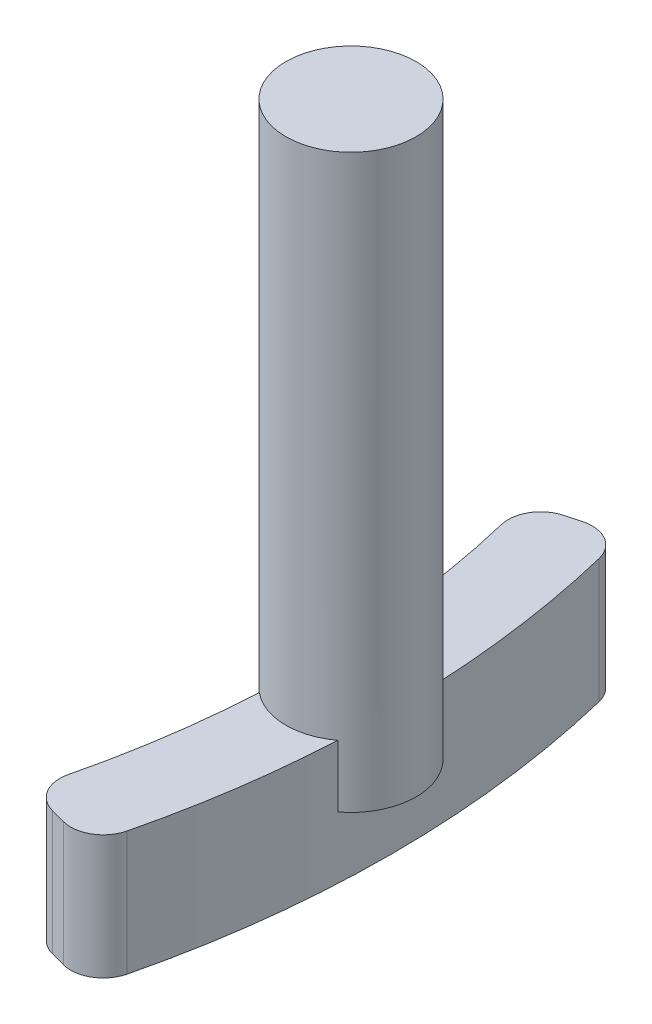
ISO-10303-21;
HEADER;
FILE_DESCRIPTION(('STEP AP214'),'2;1');
FILE_NAME('part.step','',(''),(''),'','','');
FILE_SCHEMA(('AUTOMOTIVE_DESIGN { 1 0 10303 214 1 1 1 1 }'));
ENDSEC;
DATA;
#1=APPLICATION_CONTEXT('core data for automotive mechanical design processes');
#2=APPLICATION_PROTOCOL_DEFINITION('international standard','automotive_design',2000,#1);
#3=PRODUCT_CONTEXT('',#1,'mechanical');
#4=PRODUCT('Part','Part','',(#3));
#5=PRODUCT_RELATED_PRODUCT_CATEGORY('part','',(#4));
#6=PRODUCT_DEFINITION_FORMATION('','',#4);
#7=PRODUCT_DEFINITION_CONTEXT('part definition',#1,'design');
#8=PRODUCT_DEFINITION('design','',#6,#7);
#9=PRODUCT_DEFINITION_SHAPE('','',#8);
#10=(LENGTH_UNIT() NAMED_UNIT(*) SI_UNIT(.MILLI.,.METRE.));
#11=(NAMED_UNIT(*) PLANE_ANGLE_UNIT() SI_UNIT($,.RADIAN.));
#12=(NAMED_UNIT(*) SI_UNIT($,.STERADIAN.) SOLID_ANGLE_UNIT());
#13=UNCERTAINTY_MEASURE_WITH_UNIT(LENGTH_MEASURE(1.E-05),#10,'distance_accuracy_value','');
#14=(GEOMETRIC_REPRESENTATION_CONTEXT(3) GLOBAL_UNCERTAINTY_ASSIGNED_CONTEXT((#13)) GLOBAL_UNIT_ASSIGNED_CONTEXT((#10,
#11,#12)) REPRESENTATION_CONTEXT('',''));
#15=CARTESIAN_POINT('',(0.,0.,0.));
#16=DIRECTION('',(0.,0.,1.));
#17=DIRECTION('',(1.,0.,0.));
#18=AXIS2_PLACEMENT_3D('',#15,#16,#17);
#19=CARTESIAN_POINT('',(-30.5687487202427,4.,-6.82173660494919E-13));
#20=DIRECTION('',(0.,-1.,0.));
#21=DIRECTION('',(0.,0.,-1.));
#22=AXIS2_PLACEMENT_3D('',#19,#20,#21);
#23=CYLINDRICAL_SURFACE('',#22,32.2999999999997);
#24=DIRECTION('',(0.,-1.,0.));
#25=VECTOR('',#24,1.);
#26=CARTESIAN_POINT('',(1.687380312015,11.22,1.68289626962537));
#27=LINE('',#26,#25);
#28=CARTESIAN_POINT('',(1.68738031201498,4.,1.68289626962534));
#29=VERTEX_POINT('',#28);
#30=CARTESIAN_POINT('',(1.68738031201497,2.,1.68289626962539));
#31=VERTEX_POINT('',#30);
#32=EDGE_CURVE('E201',#29,#31,#27,.T.);
#33=ORIENTED_EDGE('',*,*,#32,.F.);
#34=CARTESIAN_POINT('',(-30.5687487202427,4.,-6.82173660494919E-13));
#35=DIRECTION('',(0.,1.,0.));
#36=DIRECTION('',(0.,0.,1.));
#37=AXIS2_PLACEMENT_3D('',#34,#35,#36);
#38=CIRCLE('',#37,32.2999999999997);
#39=CARTESIAN_POINT('',(0.822305269976738,4.,7.6086614711849));
#40=VERTEX_POINT('',#39);
#41=EDGE_CURVE('E190',#40,#29,#38,.T.);
#42=ORIENTED_EDGE('',*,*,#41,.F.);
#43=DIRECTION('',(0.,-1.,0.));
#44=VECTOR('',#43,1.);
#45=CARTESIAN_POINT('',(0.822305269976738,4.,7.6086614711849));
#46=LINE('',#45,#44);
#47=CARTESIAN_POINT('',(0.822305269976738,0.,7.6086614711849));
#48=VERTEX_POINT('',#47);
#49=EDGE_CURVE('E151',#40,#48,#46,.T.);
#50=ORIENTED_EDGE('',*,*,#49,.T.);
#51=CARTESIAN_POINT('',(-30.5687487202427,0.,-6.82173660494919E-13));
#52=DIRECTION('',(0.,1.,0.));
#53=DIRECTION('',(0.,0.,1.));
#54=AXIS2_PLACEMENT_3D('',#51,#52,#53);
#55=CIRCLE('',#54,32.2999999999997);
#56=CARTESIAN_POINT('',(0.82230526997655,0.,-7.60866147118717));
#57=VERTEX_POINT('',#56);
#58=EDGE_CURVE('E176',#48,#57,#55,.T.);
#59=ORIENTED_EDGE('',*,*,#58,.T.);
#60=DIRECTION('',(0.,-1.,0.));
#61=VECTOR('',#60,1.);
#62=CARTESIAN_POINT('',(0.82230526997655,4.,-7.60866147118717));
#63=LINE('',#62,#61);
#64=CARTESIAN_POINT('',(0.82230526997655,4.,-7.60866147118717));
#65=VERTEX_POINT('',#64);
#66=EDGE_CURVE('E154',#65,#57,#63,.T.);
#67=ORIENTED_EDGE('',*,*,#66,.F.);
#68=CARTESIAN_POINT('',(1.68738031201505,4.,-1.68289626962529));
#69=VERTEX_POINT('',#68);
#70=EDGE_CURVE('E193',#69,#65,#38,.T.);
#71=ORIENTED_EDGE('',*,*,#70,.F.);
#72=DIRECTION('',(0.,-1.,0.));
#73=VECTOR('',#72,1.);
#74=CARTESIAN_POINT('',(1.68738031201508,11.22,-1.68289626962532));
#75=LINE('',#74,#73);
#76=CARTESIAN_POINT('',(1.68738031201505,2.,-1.68289626962534));
#77=VERTEX_POINT('',#76);
#78=EDGE_CURVE('E48',#77,#69,#75,.F.);
#79=ORIENTED_EDGE('',*,*,#78,.F.);
#80=CARTESIAN_POINT('',(-30.5687487202427,2.,-6.82173660494919E-13));
#81=DIRECTION('',(0.,1.,0.));
#82=DIRECTION('',(0.,0.,1.));
#83=AXIS2_PLACEMENT_3D('',#80,#81,#82);
#84=CIRCLE('',#83,32.2999999999997);
#85=EDGE_CURVE('E52',#31,#77,#84,.T.);
#86=ORIENTED_EDGE('',*,*,#85,.F.);
#87=EDGE_LOOP('',(#33,#42,#50,#59,#67,#71,#79,#86));
#88=FACE_BOUND('',#87,.T.);
#89=ADVANCED_FACE('F33',(#88),#23,.T.);
#90=CARTESIAN_POINT('',(-30.5687487202427,4.,-6.82173660494919E-13));
#91=DIRECTION('',(0.,-1.,0.));
#92=DIRECTION('',(0.,0.,-1.));
#93=AXIS2_PLACEMENT_3D('',#90,#91,#92);
#94=CYLINDRICAL_SURFACE('',#93,29.6999999999998);
#95=DIRECTION('',(0.,-1.,0.));
#96=VECTOR('',#95,1.);
#97=CARTESIAN_POINT('',(-0.912619687984859,11.22,1.61369477351205));
#98=LINE('',#97,#96);
#99=CARTESIAN_POINT('',(-0.912619687984854,2.,1.61369477351206));
#100=VERTEX_POINT('',#99);
#101=CARTESIAN_POINT('',(-0.91261968798485,4.,1.61369477351204));
#102=VERTEX_POINT('',#101);
#103=EDGE_CURVE('E203',#100,#102,#98,.F.);
#104=ORIENTED_EDGE('',*,*,#103,.F.);
#105=CARTESIAN_POINT('',(-30.5687487202427,2.,-6.82173660494919E-13));
#106=DIRECTION('',(0.,1.,0.));
#107=DIRECTION('',(0.,0.,1.));
#108=AXIS2_PLACEMENT_3D('',#105,#106,#107);
#109=CIRCLE('',#108,29.6999999999998);
#110=CARTESIAN_POINT('',(-0.912619687984783,2.,-1.61369477351212));
#111=VERTEX_POINT('',#110);
#112=EDGE_CURVE('E11',#111,#100,#109,.F.);
#113=ORIENTED_EDGE('',*,*,#112,.F.);
#114=DIRECTION('',(0.,-1.,0.));
#115=VECTOR('',#114,1.);
#116=CARTESIAN_POINT('',(-0.91261968798479,11.22,-1.61369477351211));
#117=LINE('',#116,#115);
#118=CARTESIAN_POINT('',(-0.91261968798478,4.,-1.6136947735121));
#119=VERTEX_POINT('',#118);
#120=EDGE_CURVE('E134',#119,#111,#117,.T.);
#121=ORIENTED_EDGE('',*,*,#120,.F.);
#122=CARTESIAN_POINT('',(-30.5687487202427,4.,-6.82173660494919E-13));
#123=DIRECTION('',(0.,-1.,0.));
#124=DIRECTION('',(0.,0.,1.));
#125=AXIS2_PLACEMENT_3D('',#122,#123,#124);
#126=CIRCLE('',#125,29.6999999999998);
#127=CARTESIAN_POINT('',(-1.70179997284685,4.,-6.98493163998171));
#128=VERTEX_POINT('',#127);
#129=EDGE_CURVE('E120',#128,#119,#126,.T.);
#130=ORIENTED_EDGE('',*,*,#129,.F.);
#131=DIRECTION('',(0.,-1.,0.));
#132=VECTOR('',#131,1.);
#133=CARTESIAN_POINT('',(-1.70179997284685,4.,-6.98493163998171));
#134=LINE('',#133,#132);
#135=CARTESIAN_POINT('',(-1.70179997284685,0.,-6.98493163998171));
#136=VERTEX_POINT('',#135);
#137=EDGE_CURVE('E163',#128,#136,#134,.T.);
#138=ORIENTED_EDGE('',*,*,#137,.T.);
#139=CARTESIAN_POINT('',(-30.5687487202427,0.,-6.82173660494919E-13));
#140=DIRECTION('',(0.,-1.,0.));
#141=DIRECTION('',(0.,0.,1.));
#142=AXIS2_PLACEMENT_3D('',#139,#140,#141);
#143=CIRCLE('',#142,29.6999999999998);
#144=CARTESIAN_POINT('',(-1.7017999728469,0.,6.98493163998071));
#145=VERTEX_POINT('',#144);
#146=EDGE_CURVE('E167',#136,#145,#143,.T.);
#147=ORIENTED_EDGE('',*,*,#146,.T.);
#148=DIRECTION('',(0.,-1.,0.));
#149=VECTOR('',#148,1.);
#150=CARTESIAN_POINT('',(-1.7017999728469,4.,6.98493163998071));
#151=LINE('',#150,#149);
#152=CARTESIAN_POINT('',(-1.7017999728469,4.,6.98493163998071));
#153=VERTEX_POINT('',#152);
#154=EDGE_CURVE('E130',#153,#145,#151,.T.);
#155=ORIENTED_EDGE('',*,*,#154,.F.);
#156=EDGE_CURVE('E131',#102,#153,#126,.T.);
#157=ORIENTED_EDGE('',*,*,#156,.F.);
#158=EDGE_LOOP('',(#104,#113,#121,#130,#138,#147,#155,#157));
#159=FACE_BOUND('',#158,.T.);
#160=ADVANCED_FACE('F135',(#159),#94,.F.);
#161=CARTESIAN_POINT('',(-0.681251279757298,4.,7.23187366765677));
#162=DIRECTION('',(0.,-1.,0.));
#163=DIRECTION('',(0.,0.,-1.));
#164=AXIS2_PLACEMENT_3D('',#161,#162,#163);
#165=PLANE('',#164);
#166=CARTESIAN_POINT('',(0.431251279757166,4.,0.));
#167=DIRECTION('',(0.,-1.,0.));
#168=DIRECTION('',(0.,0.,-1.));
#169=AXIS2_PLACEMENT_3D('',#166,#167,#168);
#170=CIRCLE('',#169,2.1);
#171=EDGE_CURVE('E41',#102,#29,#170,.F.);
#172=ORIENTED_EDGE('',*,*,#171,.F.);
#173=ORIENTED_EDGE('',*,*,#156,.T.);
#174=CARTESIAN_POINT('',(-0.681251279757298,4.,7.23187366765677));
#175=DIRECTION('',(0.,1.,0.));
#176=DIRECTION('',(0.,0.,-1.));
#177=AXIS2_PLACEMENT_3D('',#174,#175,#176);
#178=CIRCLE('',#177,1.04999999999977);
#179=CARTESIAN_POINT('',(-0.953011277114521,4.,8.24609578526013));
#180=VERTEX_POINT('',#179);
#181=EDGE_CURVE('E169',#153,#180,#178,.T.);
#182=ORIENTED_EDGE('',*,*,#181,.T.);
#183=DIRECTION('',(0.965925826289159,0.,0.258819045102184));
#184=VECTOR('',#183,1.);
#185=CARTESIAN_POINT('',(-0.953011277114521,4.,8.24609578526013));
#186=LINE('',#185,#184);
#187=CARTESIAN_POINT('',(-0.469906946877048,4.,8.37554320040706));
#188=VERTEX_POINT('',#187);
#189=EDGE_CURVE('E196',#180,#188,#186,.T.);
#190=ORIENTED_EDGE('',*,*,#189,.T.);
#191=CARTESIAN_POINT('',(-0.198146949520289,4.,7.36132108280253));
#192=DIRECTION('',(0.,1.,0.));
#193=DIRECTION('',(0.,0.,-1.));
#194=AXIS2_PLACEMENT_3D('',#191,#192,#193);
#195=CIRCLE('',#194,1.05000000000074);
#196=EDGE_CURVE('E194',#188,#40,#195,.T.);
#197=ORIENTED_EDGE('',*,*,#196,.T.);
#198=ORIENTED_EDGE('',*,*,#41,.T.);
#199=EDGE_LOOP('',(#172,#173,#182,#190,#197,#198));
#200=FACE_BOUND('',#199,.T.);
#201=ADVANCED_FACE('F232',(#200),#165,.F.);
#202=CARTESIAN_POINT('',(-0.681251279757298,4.,7.23187366765677));
#203=DIRECTION('',(0.,-1.,0.));
#204=DIRECTION('',(0.,0.,-1.));
#205=AXIS2_PLACEMENT_3D('',#202,#203,#204);
#206=CYLINDRICAL_SURFACE('',#205,1.04999999999977);
#207=CARTESIAN_POINT('',(-0.681251279757298,0.,7.23187366765677));
#208=DIRECTION('',(0.,1.,0.));
#209=DIRECTION('',(0.,0.,-1.));
#210=AXIS2_PLACEMENT_3D('',#207,#208,#209);
#211=CIRCLE('',#210,1.04999999999977);
#212=CARTESIAN_POINT('',(-0.953011277114521,0.,8.24609578526013));
#213=VERTEX_POINT('',#212);
#214=EDGE_CURVE('E182',#145,#213,#211,.T.);
#215=ORIENTED_EDGE('',*,*,#214,.T.);
#216=DIRECTION('',(0.,-1.,0.));
#217=VECTOR('',#216,1.);
#218=CARTESIAN_POINT('',(-0.953011277114521,4.,8.24609578526013));
#219=LINE('',#218,#217);
#220=EDGE_CURVE('E144',#180,#213,#219,.T.);
#221=ORIENTED_EDGE('',*,*,#220,.F.);
#222=ORIENTED_EDGE('',*,*,#181,.F.);
#223=ORIENTED_EDGE('',*,*,#154,.T.);
#224=EDGE_LOOP('',(#215,#221,#222,#223));
#225=FACE_BOUND('',#224,.T.);
#226=ADVANCED_FACE('F35',(#225),#206,.T.);
#227=CARTESIAN_POINT('',(-0.953011277114521,4.,8.24609578526013));
#228=DIRECTION('',(0.258819045102183,0.,-0.965925826289159));
#229=DIRECTION('',(-0.965925826289159,0.,-0.258819045102184));
#230=AXIS2_PLACEMENT_3D('',#227,#228,#229);
#231=PLANE('',#230);
#232=DIRECTION('',(0.965925826289159,0.,0.258819045102184));
#233=VECTOR('',#232,1.);
#234=CARTESIAN_POINT('',(-0.953011277114521,0.,8.24609578526013));
#235=LINE('',#234,#233);
#236=CARTESIAN_POINT('',(-0.469906946877048,0.,8.37554320040706));
#237=VERTEX_POINT('',#236);
#238=EDGE_CURVE('E180',#213,#237,#235,.T.);
#239=ORIENTED_EDGE('',*,*,#238,.T.);
#240=DIRECTION('',(0.,-1.,0.));
#241=VECTOR('',#240,1.);
#242=CARTESIAN_POINT('',(-0.469906946877048,4.,8.37554320040706));
#243=LINE('',#242,#241);
#244=EDGE_CURVE('E146',#188,#237,#243,.T.);
#245=ORIENTED_EDGE('',*,*,#244,.F.);
#246=ORIENTED_EDGE('',*,*,#189,.F.);
#247=ORIENTED_EDGE('',*,*,#220,.T.);
#248=EDGE_LOOP('',(#239,#245,#246,#247));
#249=FACE_BOUND('',#248,.T.);
#250=ADVANCED_FACE('F240',(#249),#231,.F.);
#251=CARTESIAN_POINT('',(-0.198146949520289,4.,7.36132108280253));
#252=DIRECTION('',(0.,-1.,0.));
#253=DIRECTION('',(0.,0.,-1.));
#254=AXIS2_PLACEMENT_3D('',#251,#252,#253);
#255=CYLINDRICAL_SURFACE('',#254,1.05000000000074);
#256=CARTESIAN_POINT('',(-0.198146949520289,0.,7.36132108280253));
#257=DIRECTION('',(0.,1.,0.));
#258=DIRECTION('',(0.,0.,-1.));
#259=AXIS2_PLACEMENT_3D('',#256,#257,#258);
#260=CIRCLE('',#259,1.05000000000074);
#261=EDGE_CURVE('E178',#237,#48,#260,.T.);
#262=ORIENTED_EDGE('',*,*,#261,.T.);
#263=ORIENTED_EDGE('',*,*,#49,.F.);
#264=ORIENTED_EDGE('',*,*,#196,.F.);
#265=ORIENTED_EDGE('',*,*,#244,.T.);
#266=EDGE_LOOP('',(#262,#263,#264,#265));
#267=FACE_BOUND('',#266,.T.);
#268=ADVANCED_FACE('F238',(#267),#255,.T.);
#269=CARTESIAN_POINT('',(-0.198146949519636,4.,-7.36132108280495));
#270=DIRECTION('',(0.,-1.,0.));
#271=DIRECTION('',(0.,0.,-1.));
#272=AXIS2_PLACEMENT_3D('',#269,#270,#271);
#273=CYLINDRICAL_SURFACE('',#272,1.04999999999996);
#274=CARTESIAN_POINT('',(-0.198146949519636,0.,-7.36132108280495));
#275=DIRECTION('',(0.,1.,0.));
#276=DIRECTION('',(0.,0.,-1.));
#277=AXIS2_PLACEMENT_3D('',#274,#275,#276);
#278=CIRCLE('',#277,1.04999999999996);
#279=CARTESIAN_POINT('',(-0.469906946877274,0.,-8.37554320040844));
#280=VERTEX_POINT('',#279);
#281=EDGE_CURVE('E174',#57,#280,#278,.T.);
#282=ORIENTED_EDGE('',*,*,#281,.T.);
#283=DIRECTION('',(0.,-1.,0.));
#284=VECTOR('',#283,1.);
#285=CARTESIAN_POINT('',(-0.469906946877274,4.,-8.37554320040844));
#286=LINE('',#285,#284);
#287=CARTESIAN_POINT('',(-0.469906946877274,4.,-8.37554320040844));
#288=VERTEX_POINT('',#287);
#289=EDGE_CURVE('E157',#288,#280,#286,.T.);
#290=ORIENTED_EDGE('',*,*,#289,.F.);
#291=CARTESIAN_POINT('',(-0.198146949519636,4.,-7.36132108280495));
#292=DIRECTION('',(0.,1.,0.));
#293=DIRECTION('',(0.,0.,-1.));
#294=AXIS2_PLACEMENT_3D('',#291,#292,#293);
#295=CIRCLE('',#294,1.04999999999996);
#296=EDGE_CURVE('E188',#65,#288,#295,.T.);
#297=ORIENTED_EDGE('',*,*,#296,.F.);
#298=ORIENTED_EDGE('',*,*,#66,.T.);
#299=EDGE_LOOP('',(#282,#290,#297,#298));
#300=FACE_BOUND('',#299,.T.);
#301=ADVANCED_FACE('F236',(#300),#273,.T.);
#302=CARTESIAN_POINT('',(-0.953011277114749,4.,-8.24609578526136));
#303=DIRECTION('',(0.258819045102531,0.,0.965925826289066));
#304=DIRECTION('',(0.965925826289066,0.,-0.258819045102531));
#305=AXIS2_PLACEMENT_3D('',#302,#303,#304);
#306=PLANE('',#305);
#307=DIRECTION('',(-0.965925826289066,0.,0.258819045102531));
#308=VECTOR('',#307,1.);
#309=CARTESIAN_POINT('',(-0.953011277114749,0.,-8.24609578526136));
#310=LINE('',#309,#308);
#311=CARTESIAN_POINT('',(-0.953011277114749,0.,-8.24609578526136));
#312=VERTEX_POINT('',#311);
#313=EDGE_CURVE('E172',#280,#312,#310,.T.);
#314=ORIENTED_EDGE('',*,*,#313,.T.);
#315=DIRECTION('',(0.,-1.,0.));
#316=VECTOR('',#315,1.);
#317=CARTESIAN_POINT('',(-0.953011277114749,4.,-8.24609578526136));
#318=LINE('',#317,#316);
#319=CARTESIAN_POINT('',(-0.953011277114749,4.,-8.24609578526136));
#320=VERTEX_POINT('',#319);
#321=EDGE_CURVE('E160',#320,#312,#318,.T.);
#322=ORIENTED_EDGE('',*,*,#321,.F.);
#323=DIRECTION('',(-0.965925826289066,0.,0.258819045102531));
#324=VECTOR('',#323,1.);
#325=CARTESIAN_POINT('',(-0.953011277114749,4.,-8.24609578526136));
#326=LINE('',#325,#324);
#327=EDGE_CURVE('E186',#288,#320,#326,.T.);
#328=ORIENTED_EDGE('',*,*,#327,.F.);
#329=ORIENTED_EDGE('',*,*,#289,.T.);
#330=EDGE_LOOP('',(#314,#322,#328,#329));
#331=FACE_BOUND('',#330,.T.);
#332=ADVANCED_FACE('F267',(#331),#306,.F.);
#333=CARTESIAN_POINT('',(-0.681251279757095,4.,-7.23187366765784));
#334=DIRECTION('',(0.,-1.,0.));
#335=DIRECTION('',(0.,0.,-1.));
#336=AXIS2_PLACEMENT_3D('',#333,#334,#335);
#337=CYLINDRICAL_SURFACE('',#336,1.05);
#338=CARTESIAN_POINT('',(-0.681251279757095,0.,-7.23187366765784));
#339=DIRECTION('',(0.,1.,0.));
#340=DIRECTION('',(0.,0.,1.));
#341=AXIS2_PLACEMENT_3D('',#338,#339,#340);
#342=CIRCLE('',#341,1.05);
#343=EDGE_CURVE('E170',#312,#136,#342,.T.);
#344=ORIENTED_EDGE('',*,*,#343,.T.);
#345=ORIENTED_EDGE('',*,*,#137,.F.);
#346=CARTESIAN_POINT('',(-0.681251279757095,4.,-7.23187366765784));
#347=DIRECTION('',(0.,1.,0.));
#348=DIRECTION('',(0.,0.,1.));
#349=AXIS2_PLACEMENT_3D('',#346,#347,#348);
#350=CIRCLE('',#349,1.05);
#351=EDGE_CURVE('E126',#320,#128,#350,.T.);
#352=ORIENTED_EDGE('',*,*,#351,.F.);
#353=ORIENTED_EDGE('',*,*,#321,.T.);
#354=EDGE_LOOP('',(#344,#345,#352,#353));
#355=FACE_BOUND('',#354,.T.);
#356=ADVANCED_FACE('F270',(#355),#337,.T.);
#357=EDGE_CURVE('E124',#69,#119,#170,.F.);
#358=ORIENTED_EDGE('',*,*,#357,.F.);
#359=ORIENTED_EDGE('',*,*,#70,.T.);
#360=ORIENTED_EDGE('',*,*,#296,.T.);
#361=ORIENTED_EDGE('',*,*,#327,.T.);
#362=ORIENTED_EDGE('',*,*,#351,.T.);
#363=ORIENTED_EDGE('',*,*,#129,.T.);
#364=EDGE_LOOP('',(#358,#359,#360,#361,#362,#363));
#365=FACE_BOUND('',#364,.T.);
#366=ADVANCED_FACE('F122',(#365),#165,.F.);
#367=CARTESIAN_POINT('',(-0.681251279757298,0.,7.23187366765677));
#368=DIRECTION('',(0.,-1.,0.));
#369=DIRECTION('',(0.,0.,-1.));
#370=AXIS2_PLACEMENT_3D('',#367,#368,#369);
#371=PLANE('',#370);
#372=ORIENTED_EDGE('',*,*,#214,.F.);
#373=ORIENTED_EDGE('',*,*,#146,.F.);
#374=ORIENTED_EDGE('',*,*,#343,.F.);
#375=ORIENTED_EDGE('',*,*,#313,.F.);
#376=ORIENTED_EDGE('',*,*,#281,.F.);
#377=ORIENTED_EDGE('',*,*,#58,.F.);
#378=ORIENTED_EDGE('',*,*,#261,.F.);
#379=ORIENTED_EDGE('',*,*,#238,.F.);
#380=EDGE_LOOP('',(#372,#373,#374,#375,#376,#377,#378,#379));
#381=FACE_BOUND('',#380,.T.);
#382=ADVANCED_FACE('F256',(#381),#371,.T.);
#383=CARTESIAN_POINT('',(0.431251279757166,2.,0.));
#384=DIRECTION('',(0.,1.,0.));
#385=DIRECTION('',(0.,0.,1.));
#386=AXIS2_PLACEMENT_3D('',#383,#384,#385);
#387=PLANE('',#386);
#388=CARTESIAN_POINT('',(0.431251279757166,2.,0.));
#389=DIRECTION('',(0.,1.,0.));
#390=DIRECTION('',(0.,0.,1.));
#391=AXIS2_PLACEMENT_3D('',#388,#389,#390);
#392=CIRCLE('',#391,2.1);
#393=EDGE_CURVE('E207',#31,#77,#392,.T.);
#394=ORIENTED_EDGE('',*,*,#393,.F.);
#395=ORIENTED_EDGE('',*,*,#85,.T.);
#396=EDGE_LOOP('',(#394,#395));
#397=FACE_BOUND('',#396,.T.);
#398=ADVANCED_FACE('F223',(#397),#387,.F.);
#399=EDGE_CURVE('E209',#111,#100,#392,.T.);
#400=ORIENTED_EDGE('',*,*,#399,.F.);
#401=ORIENTED_EDGE('',*,*,#112,.T.);
#402=EDGE_LOOP('',(#400,#401));
#403=FACE_BOUND('',#402,.T.);
#404=ADVANCED_FACE('F216',(#403),#387,.F.);
#405=CARTESIAN_POINT('',(0.431251279757166,20.44,0.));
#406=DIRECTION('',(0.,-1.,0.));
#407=DIRECTION('',(0.,0.,-1.));
#408=AXIS2_PLACEMENT_3D('',#405,#406,#407);
#409=CYLINDRICAL_SURFACE('',#408,2.1);
#410=CARTESIAN_POINT('',(0.431251279757166,20.44,0.));
#411=DIRECTION('',(0.,1.,0.));
#412=DIRECTION('',(0.,0.,1.));
#413=AXIS2_PLACEMENT_3D('',#410,#411,#412);
#414=CIRCLE('',#413,2.1);
#415=CARTESIAN_POINT('',(0.431251279757166,20.44,2.1));
#416=VERTEX_POINT('',#415);
#417=EDGE_CURVE('E139',#416,#416,#414,.T.);
#418=ORIENTED_EDGE('',*,*,#417,.F.);
#419=EDGE_LOOP('',(#418));
#420=FACE_BOUND('',#419,.T.);
#421=ORIENTED_EDGE('',*,*,#171,.T.);
#422=ORIENTED_EDGE('',*,*,#32,.T.);
#423=ORIENTED_EDGE('',*,*,#393,.T.);
#424=ORIENTED_EDGE('',*,*,#78,.T.);
#425=ORIENTED_EDGE('',*,*,#357,.T.);
#426=ORIENTED_EDGE('',*,*,#120,.T.);
#427=ORIENTED_EDGE('',*,*,#399,.T.);
#428=ORIENTED_EDGE('',*,*,#103,.T.);
#429=EDGE_LOOP('',(#421,#422,#423,#424,#425,#426,#427,#428));
#430=FACE_BOUND('',#429,.T.);
#431=ADVANCED_FACE('F142',(#420,#430),#409,.T.);
#432=CARTESIAN_POINT('',(0.431251279757166,20.44,0.));
#433=DIRECTION('',(0.,1.,0.));
#434=DIRECTION('',(0.,0.,1.));
#435=AXIS2_PLACEMENT_3D('',#432,#433,#434);
#436=PLANE('',#435);
#437=ORIENTED_EDGE('',*,*,#417,.T.);
#438=EDGE_LOOP('',(#437));
#439=FACE_BOUND('',#438,.T.);
#440=ADVANCED_FACE('F213',(#439),#436,.T.);
#441=CLOSED_SHELL('',(#89,#160,#201,#226,#250,#268,#301,#332,#356,#366,#382,#398,#404,#431,#440));
#442=MANIFOLD_SOLID_BREP('B2',#441);
#443=ADVANCED_BREP_SHAPE_REPRESENTATION('',(#18,#442),#14);
#444=SHAPE_DEFINITION_REPRESENTATION(#9,#443);
ENDSEC;
END-ISO-10303-21;
